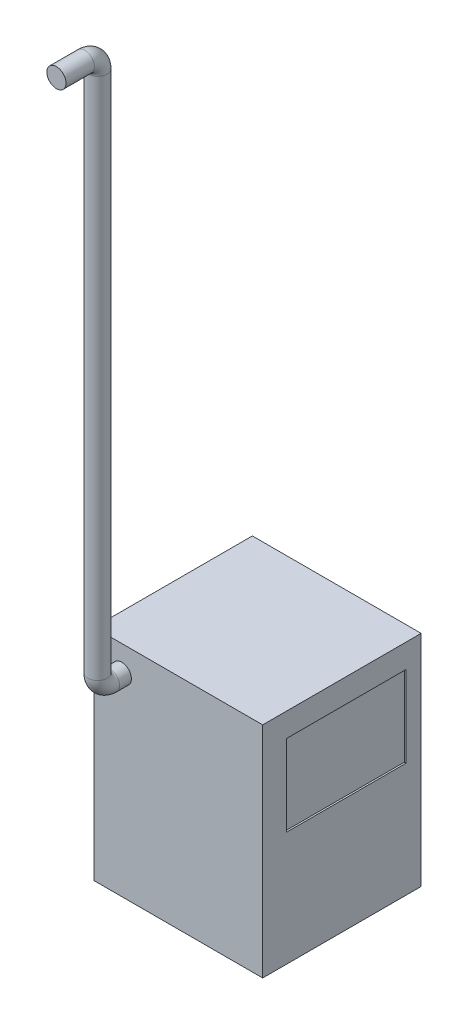
ISO-10303-21;
HEADER;
FILE_DESCRIPTION(('STEP AP214'),'2;1');
FILE_NAME('part.step','',(''),(''),'','','');
FILE_SCHEMA(('AUTOMOTIVE_DESIGN { 1 0 10303 214 1 1 1 1 }'));
ENDSEC;
DATA;
#1=APPLICATION_CONTEXT('core data for automotive mechanical design processes');
#2=APPLICATION_PROTOCOL_DEFINITION('international standard','automotive_design',2000,#1);
#3=PRODUCT_CONTEXT('',#1,'mechanical');
#4=PRODUCT('Part','Part','',(#3));
#5=PRODUCT_RELATED_PRODUCT_CATEGORY('part','',(#4));
#6=PRODUCT_DEFINITION_FORMATION('','',#4);
#7=PRODUCT_DEFINITION_CONTEXT('part definition',#1,'design');
#8=PRODUCT_DEFINITION('design','',#6,#7);
#9=PRODUCT_DEFINITION_SHAPE('','',#8);
#10=(LENGTH_UNIT() NAMED_UNIT(*) SI_UNIT(.MILLI.,.METRE.));
#11=(NAMED_UNIT(*) PLANE_ANGLE_UNIT() SI_UNIT($,.RADIAN.));
#12=(NAMED_UNIT(*) SI_UNIT($,.STERADIAN.) SOLID_ANGLE_UNIT());
#13=UNCERTAINTY_MEASURE_WITH_UNIT(LENGTH_MEASURE(1.E-05),#10,'distance_accuracy_value','');
#14=(GEOMETRIC_REPRESENTATION_CONTEXT(3) GLOBAL_UNCERTAINTY_ASSIGNED_CONTEXT((#13)) GLOBAL_UNIT_ASSIGNED_CONTEXT((#10,
#11,#12)) REPRESENTATION_CONTEXT('',''));
#15=CARTESIAN_POINT('',(0.,0.,0.));
#16=DIRECTION('',(0.,0.,1.));
#17=DIRECTION('',(1.,0.,0.));
#18=AXIS2_PLACEMENT_3D('',#15,#16,#17);
#19=CARTESIAN_POINT('',(200.,129.891252072639,-93.8981552431528));
#20=DIRECTION('',(0.,0.,1.));
#21=DIRECTION('',(1.,0.,0.));
#22=AXIS2_PLACEMENT_3D('',#19,#20,#21);
#23=PLANE('',#22);
#24=DIRECTION('',(0.,1.,0.));
#25=VECTOR('',#24,1.);
#26=CARTESIAN_POINT('',(0.,129.891252072639,-93.8981552431528));
#27=LINE('',#26,#25);
#28=CARTESIAN_POINT('',(0.,-129.891252072639,-93.8981552431528));
#29=VERTEX_POINT('',#28);
#30=CARTESIAN_POINT('',(0.,129.891252072639,-93.8981552431528));
#31=VERTEX_POINT('',#30);
#32=EDGE_CURVE('E143',#29,#31,#27,.T.);
#33=ORIENTED_EDGE('',*,*,#32,.T.);
#34=DIRECTION('',(-1.,0.,0.));
#35=VECTOR('',#34,1.);
#36=CARTESIAN_POINT('',(200.,129.891252072639,-93.8981552431528));
#37=LINE('',#36,#35);
#38=CARTESIAN_POINT('',(200.,129.891252072639,-93.8981552431528));
#39=VERTEX_POINT('',#38);
#40=EDGE_CURVE('E11',#39,#31,#37,.T.);
#41=ORIENTED_EDGE('',*,*,#40,.F.);
#42=DIRECTION('',(0.,1.,0.));
#43=VECTOR('',#42,1.);
#44=CARTESIAN_POINT('',(200.,129.891252072639,-93.8981552431528));
#45=LINE('',#44,#43);
#46=CARTESIAN_POINT('',(200.,-129.891252072639,-93.8981552431528));
#47=VERTEX_POINT('',#46);
#48=EDGE_CURVE('E147',#47,#39,#45,.T.);
#49=ORIENTED_EDGE('',*,*,#48,.F.);
#50=DIRECTION('',(-1.,0.,0.));
#51=VECTOR('',#50,1.);
#52=CARTESIAN_POINT('',(200.,-129.891252072639,-93.8981552431528));
#53=LINE('',#52,#51);
#54=EDGE_CURVE('E153',#47,#29,#53,.T.);
#55=ORIENTED_EDGE('',*,*,#54,.T.);
#56=EDGE_LOOP('',(#33,#41,#49,#55));
#57=FACE_BOUND('',#56,.T.);
#58=ADVANCED_FACE('F32',(#57),#23,.F.);
#59=CARTESIAN_POINT('',(200.,129.891252072639,93.8981552431528));
#60=DIRECTION('',(0.,-1.,0.));
#61=DIRECTION('',(0.,0.,-1.));
#62=AXIS2_PLACEMENT_3D('',#59,#60,#61);
#63=PLANE('',#62);
#64=DIRECTION('',(0.,0.,1.));
#65=VECTOR('',#64,1.);
#66=CARTESIAN_POINT('',(0.,129.891252072639,93.8981552431528));
#67=LINE('',#66,#65);
#68=CARTESIAN_POINT('',(0.,129.891252072639,93.8981552431528));
#69=VERTEX_POINT('',#68);
#70=EDGE_CURVE('E156',#31,#69,#67,.T.);
#71=ORIENTED_EDGE('',*,*,#70,.T.);
#72=DIRECTION('',(-1.,0.,0.));
#73=VECTOR('',#72,1.);
#74=CARTESIAN_POINT('',(200.,129.891252072639,93.8981552431528));
#75=LINE('',#74,#73);
#76=CARTESIAN_POINT('',(200.,129.891252072639,93.8981552431528));
#77=VERTEX_POINT('',#76);
#78=EDGE_CURVE('E39',#77,#69,#75,.T.);
#79=ORIENTED_EDGE('',*,*,#78,.F.);
#80=DIRECTION('',(0.,0.,1.));
#81=VECTOR('',#80,1.);
#82=CARTESIAN_POINT('',(200.,129.891252072639,93.8981552431528));
#83=LINE('',#82,#81);
#84=EDGE_CURVE('E83',#39,#77,#83,.T.);
#85=ORIENTED_EDGE('',*,*,#84,.F.);
#86=ORIENTED_EDGE('',*,*,#40,.T.);
#87=EDGE_LOOP('',(#71,#79,#85,#86));
#88=FACE_BOUND('',#87,.T.);
#89=ADVANCED_FACE('F185',(#88),#63,.F.);
#90=CARTESIAN_POINT('',(200.,129.891252072639,93.8981552431528));
#91=DIRECTION('',(0.,0.,-1.));
#92=DIRECTION('',(-1.,0.,0.));
#93=AXIS2_PLACEMENT_3D('',#90,#91,#92);
#94=PLANE('',#93);
#95=CARTESIAN_POINT('',(33.0406036423483,99.3360660067637,93.8981552431528));
#96=DIRECTION('',(0.,0.,1.));
#97=DIRECTION('',(1.,0.,0.));
#98=AXIS2_PLACEMENT_3D('',#95,#96,#97);
#99=CIRCLE('',#98,11.3678878439545);
#100=CARTESIAN_POINT('',(44.4084914863028,99.3360660067637,93.8981552431528));
#101=VERTEX_POINT('',#100);
#102=EDGE_CURVE('E342',#101,#101,#99,.T.);
#103=ORIENTED_EDGE('',*,*,#102,.F.);
#104=EDGE_LOOP('',(#103));
#105=FACE_BOUND('',#104,.T.);
#106=DIRECTION('',(0.,-1.,0.));
#107=VECTOR('',#106,1.);
#108=CARTESIAN_POINT('',(0.,129.891252072639,93.8981552431528));
#109=LINE('',#108,#107);
#110=CARTESIAN_POINT('',(0.,-129.891252072639,93.8981552431528));
#111=VERTEX_POINT('',#110);
#112=EDGE_CURVE('E158',#69,#111,#109,.T.);
#113=ORIENTED_EDGE('',*,*,#112,.T.);
#114=DIRECTION('',(-1.,0.,0.));
#115=VECTOR('',#114,1.);
#116=CARTESIAN_POINT('',(200.,-129.891252072639,93.8981552431528));
#117=LINE('',#116,#115);
#118=CARTESIAN_POINT('',(200.,-129.891252072639,93.8981552431528));
#119=VERTEX_POINT('',#118);
#120=EDGE_CURVE('E162',#119,#111,#117,.T.);
#121=ORIENTED_EDGE('',*,*,#120,.F.);
#122=DIRECTION('',(0.,-1.,0.));
#123=VECTOR('',#122,1.);
#124=CARTESIAN_POINT('',(200.,129.891252072639,93.8981552431528));
#125=LINE('',#124,#123);
#126=EDGE_CURVE('E150',#77,#119,#125,.T.);
#127=ORIENTED_EDGE('',*,*,#126,.F.);
#128=ORIENTED_EDGE('',*,*,#78,.T.);
#129=EDGE_LOOP('',(#113,#121,#127,#128));
#130=FACE_BOUND('',#129,.T.);
#131=ADVANCED_FACE('F167',(#105,#130),#94,.F.);
#132=CARTESIAN_POINT('',(200.,-129.891252072639,93.8981552431528));
#133=DIRECTION('',(0.,1.,0.));
#134=DIRECTION('',(0.,0.,1.));
#135=AXIS2_PLACEMENT_3D('',#132,#133,#134);
#136=PLANE('',#135);
#137=DIRECTION('',(0.,0.,-1.));
#138=VECTOR('',#137,1.);
#139=CARTESIAN_POINT('',(0.,-129.891252072639,93.8981552431528));
#140=LINE('',#139,#138);
#141=EDGE_CURVE('E76',#111,#29,#140,.T.);
#142=ORIENTED_EDGE('',*,*,#141,.T.);
#143=ORIENTED_EDGE('',*,*,#54,.F.);
#144=DIRECTION('',(0.,0.,-1.));
#145=VECTOR('',#144,1.);
#146=CARTESIAN_POINT('',(200.,-129.891252072639,93.8981552431528));
#147=LINE('',#146,#145);
#148=EDGE_CURVE('E55',#119,#47,#147,.T.);
#149=ORIENTED_EDGE('',*,*,#148,.F.);
#150=ORIENTED_EDGE('',*,*,#120,.T.);
#151=EDGE_LOOP('',(#142,#143,#149,#150));
#152=FACE_BOUND('',#151,.T.);
#153=ADVANCED_FACE('F175',(#152),#136,.F.);
#154=CARTESIAN_POINT('',(200.,0.,0.));
#155=DIRECTION('',(1.,0.,0.));
#156=DIRECTION('',(0.,0.,-1.));
#157=AXIS2_PLACEMENT_3D('',#154,#155,#156);
#158=PLANE('',#157);
#159=DIRECTION('',(0.,-1.,0.));
#160=VECTOR('',#159,1.);
#161=CARTESIAN_POINT('',(200.,101.766622399339,65.5680643552614));
#162=LINE('',#161,#160);
#163=CARTESIAN_POINT('',(200.,101.766622399339,65.5680643552614));
#164=VERTEX_POINT('',#163);
#165=CARTESIAN_POINT('',(200.,5.62292953907217,65.5680643552614));
#166=VERTEX_POINT('',#165);
#167=EDGE_CURVE('E46',#164,#166,#162,.T.);
#168=ORIENTED_EDGE('',*,*,#167,.F.);
#169=DIRECTION('',(0.,0.,1.));
#170=VECTOR('',#169,1.);
#171=CARTESIAN_POINT('',(200.,101.766622399339,65.5680643552614));
#172=LINE('',#171,#170);
#173=CARTESIAN_POINT('',(200.,101.766622399339,-76.1470531604118));
#174=VERTEX_POINT('',#173);
#175=EDGE_CURVE('E125',#174,#164,#172,.T.);
#176=ORIENTED_EDGE('',*,*,#175,.F.);
#177=DIRECTION('',(0.,1.,0.));
#178=VECTOR('',#177,1.);
#179=CARTESIAN_POINT('',(200.,101.766622399339,-76.1470531604118));
#180=LINE('',#179,#178);
#181=CARTESIAN_POINT('',(200.,5.62292953907217,-76.1470531604118));
#182=VERTEX_POINT('',#181);
#183=EDGE_CURVE('E128',#182,#174,#180,.T.);
#184=ORIENTED_EDGE('',*,*,#183,.F.);
#185=DIRECTION('',(0.,0.,-1.));
#186=VECTOR('',#185,1.);
#187=CARTESIAN_POINT('',(200.,5.62292953907217,65.5680643552614));
#188=LINE('',#187,#186);
#189=EDGE_CURVE('E137',#166,#182,#188,.T.);
#190=ORIENTED_EDGE('',*,*,#189,.F.);
#191=EDGE_LOOP('',(#168,#176,#184,#190));
#192=FACE_BOUND('',#191,.T.);
#193=ORIENTED_EDGE('',*,*,#48,.T.);
#194=ORIENTED_EDGE('',*,*,#84,.T.);
#195=ORIENTED_EDGE('',*,*,#126,.T.);
#196=ORIENTED_EDGE('',*,*,#148,.T.);
#197=EDGE_LOOP('',(#193,#194,#195,#196));
#198=FACE_BOUND('',#197,.T.);
#199=ADVANCED_FACE('F177',(#192,#198),#158,.T.);
#200=CARTESIAN_POINT('',(0.,0.,0.));
#201=DIRECTION('',(1.,0.,0.));
#202=DIRECTION('',(0.,0.,-1.));
#203=AXIS2_PLACEMENT_3D('',#200,#201,#202);
#204=PLANE('',#203);
#205=ORIENTED_EDGE('',*,*,#32,.F.);
#206=ORIENTED_EDGE('',*,*,#141,.F.);
#207=ORIENTED_EDGE('',*,*,#112,.F.);
#208=ORIENTED_EDGE('',*,*,#70,.F.);
#209=EDGE_LOOP('',(#205,#206,#207,#208));
#210=FACE_BOUND('',#209,.T.);
#211=ADVANCED_FACE('F171',(#210),#204,.F.);
#212=CARTESIAN_POINT('',(198.,101.766622399339,65.5680643552614));
#213=DIRECTION('',(0.,0.,1.));
#214=DIRECTION('',(1.,0.,0.));
#215=AXIS2_PLACEMENT_3D('',#212,#213,#214);
#216=PLANE('',#215);
#217=ORIENTED_EDGE('',*,*,#167,.T.);
#218=DIRECTION('',(1.,0.,0.));
#219=VECTOR('',#218,1.);
#220=CARTESIAN_POINT('',(198.,5.62292953907217,65.5680643552614));
#221=LINE('',#220,#219);
#222=CARTESIAN_POINT('',(198.,5.62292953907217,65.5680643552614));
#223=VERTEX_POINT('',#222);
#224=EDGE_CURVE('E103',#223,#166,#221,.T.);
#225=ORIENTED_EDGE('',*,*,#224,.F.);
#226=DIRECTION('',(0.,-1.,0.));
#227=VECTOR('',#226,1.);
#228=CARTESIAN_POINT('',(198.,101.766622399339,65.5680643552614));
#229=LINE('',#228,#227);
#230=CARTESIAN_POINT('',(198.,101.766622399339,65.5680643552614));
#231=VERTEX_POINT('',#230);
#232=EDGE_CURVE('E107',#231,#223,#229,.T.);
#233=ORIENTED_EDGE('',*,*,#232,.F.);
#234=DIRECTION('',(1.,0.,0.));
#235=VECTOR('',#234,1.);
#236=CARTESIAN_POINT('',(198.,101.766622399339,65.5680643552614));
#237=LINE('',#236,#235);
#238=EDGE_CURVE('E141',#231,#164,#237,.T.);
#239=ORIENTED_EDGE('',*,*,#238,.T.);
#240=EDGE_LOOP('',(#217,#225,#233,#239));
#241=FACE_BOUND('',#240,.T.);
#242=ADVANCED_FACE('F105',(#241),#216,.F.);
#243=CARTESIAN_POINT('',(198.,101.766622399339,65.5680643552614));
#244=DIRECTION('',(0.,1.,0.));
#245=DIRECTION('',(0.,0.,1.));
#246=AXIS2_PLACEMENT_3D('',#243,#244,#245);
#247=PLANE('',#246);
#248=ORIENTED_EDGE('',*,*,#175,.T.);
#249=ORIENTED_EDGE('',*,*,#238,.F.);
#250=DIRECTION('',(0.,0.,1.));
#251=VECTOR('',#250,1.);
#252=CARTESIAN_POINT('',(198.,101.766622399339,65.5680643552614));
#253=LINE('',#252,#251);
#254=CARTESIAN_POINT('',(198.,101.766622399339,-76.1470531604118));
#255=VERTEX_POINT('',#254);
#256=EDGE_CURVE('E113',#255,#231,#253,.T.);
#257=ORIENTED_EDGE('',*,*,#256,.F.);
#258=DIRECTION('',(1.,0.,0.));
#259=VECTOR('',#258,1.);
#260=CARTESIAN_POINT('',(198.,101.766622399339,-76.1470531604118));
#261=LINE('',#260,#259);
#262=EDGE_CURVE('E144',#255,#174,#261,.T.);
#263=ORIENTED_EDGE('',*,*,#262,.T.);
#264=EDGE_LOOP('',(#248,#249,#257,#263));
#265=FACE_BOUND('',#264,.T.);
#266=ADVANCED_FACE('F277',(#265),#247,.F.);
#267=CARTESIAN_POINT('',(198.,101.766622399339,-76.1470531604118));
#268=DIRECTION('',(0.,0.,-1.));
#269=DIRECTION('',(-1.,0.,0.));
#270=AXIS2_PLACEMENT_3D('',#267,#268,#269);
#271=PLANE('',#270);
#272=ORIENTED_EDGE('',*,*,#183,.T.);
#273=ORIENTED_EDGE('',*,*,#262,.F.);
#274=DIRECTION('',(0.,1.,0.));
#275=VECTOR('',#274,1.);
#276=CARTESIAN_POINT('',(198.,101.766622399339,-76.1470531604118));
#277=LINE('',#276,#275);
#278=CARTESIAN_POINT('',(198.,5.62292953907217,-76.1470531604118));
#279=VERTEX_POINT('',#278);
#280=EDGE_CURVE('E121',#279,#255,#277,.T.);
#281=ORIENTED_EDGE('',*,*,#280,.F.);
#282=DIRECTION('',(1.,0.,0.));
#283=VECTOR('',#282,1.);
#284=CARTESIAN_POINT('',(198.,5.62292953907217,-76.1470531604118));
#285=LINE('',#284,#283);
#286=EDGE_CURVE('E112',#279,#182,#285,.T.);
#287=ORIENTED_EDGE('',*,*,#286,.T.);
#288=EDGE_LOOP('',(#272,#273,#281,#287));
#289=FACE_BOUND('',#288,.T.);
#290=ADVANCED_FACE('F274',(#289),#271,.F.);
#291=CARTESIAN_POINT('',(198.,5.62292953907217,65.5680643552614));
#292=DIRECTION('',(0.,-1.,0.));
#293=DIRECTION('',(0.,0.,-1.));
#294=AXIS2_PLACEMENT_3D('',#291,#292,#293);
#295=PLANE('',#294);
#296=ORIENTED_EDGE('',*,*,#189,.T.);
#297=ORIENTED_EDGE('',*,*,#286,.F.);
#298=DIRECTION('',(0.,0.,-1.));
#299=VECTOR('',#298,1.);
#300=CARTESIAN_POINT('',(198.,5.62292953907217,65.5680643552614));
#301=LINE('',#300,#299);
#302=EDGE_CURVE('E116',#223,#279,#301,.T.);
#303=ORIENTED_EDGE('',*,*,#302,.F.);
#304=ORIENTED_EDGE('',*,*,#224,.T.);
#305=EDGE_LOOP('',(#296,#297,#303,#304));
#306=FACE_BOUND('',#305,.T.);
#307=ADVANCED_FACE('F117',(#306),#295,.F.);
#308=CARTESIAN_POINT('',(198.,0.,0.));
#309=DIRECTION('',(1.,0.,0.));
#310=DIRECTION('',(0.,0.,-1.));
#311=AXIS2_PLACEMENT_3D('',#308,#309,#310);
#312=PLANE('',#311);
#313=ORIENTED_EDGE('',*,*,#232,.T.);
#314=ORIENTED_EDGE('',*,*,#302,.T.);
#315=ORIENTED_EDGE('',*,*,#280,.T.);
#316=ORIENTED_EDGE('',*,*,#256,.T.);
#317=EDGE_LOOP('',(#313,#314,#315,#316));
#318=FACE_BOUND('',#317,.T.);
#319=ADVANCED_FACE('F123',(#318),#312,.T.);
#320=CARTESIAN_POINT('',(33.0406036423483,749.336066006764,171.355386401238));
#321=DIRECTION('',(0.,0.,1.));
#322=DIRECTION('',(1.,0.,0.));
#323=AXIS2_PLACEMENT_3D('',#320,#321,#322);
#324=PLANE('',#323);
#325=CARTESIAN_POINT('',(33.0406036423483,749.336066006764,171.355386401238));
#326=DIRECTION('',(0.,0.,1.));
#327=DIRECTION('',(1.,0.,0.));
#328=AXIS2_PLACEMENT_3D('',#325,#326,#327);
#329=CIRCLE('',#328,11.3678878439545);
#330=CARTESIAN_POINT('',(44.4084914863028,749.336066006764,171.355386401238));
#331=VERTEX_POINT('',#330);
#332=EDGE_CURVE('E131',#331,#331,#329,.T.);
#333=ORIENTED_EDGE('',*,*,#332,.T.);
#334=EDGE_LOOP('',(#333));
#335=FACE_BOUND('',#334,.T.);
#336=ADVANCED_FACE('F210',(#335),#324,.T.);
#337=CARTESIAN_POINT('',(33.0406036423483,99.3360660067637,93.8981552431528));
#338=DIRECTION('',(0.,0.,1.));
#339=DIRECTION('',(1.,0.,0.));
#340=AXIS2_PLACEMENT_3D('',#337,#338,#339);
#341=CYLINDRICAL_SURFACE('',#340,11.3678878439545);
#342=CARTESIAN_POINT('',(33.0406036423483,99.3360660067637,107.772716537554));
#343=DIRECTION('',(0.,0.,1.));
#344=DIRECTION('',(1.,0.,0.));
#345=AXIS2_PLACEMENT_3D('',#342,#343,#344);
#346=CIRCLE('',#345,11.3678878439545);
#347=CARTESIAN_POINT('',(33.0406036423483,87.9681781628092,107.772716537554));
#348=VERTEX_POINT('',#347);
#349=EDGE_CURVE('E339',#348,#348,#346,.T.);
#350=ORIENTED_EDGE('',*,*,#349,.F.);
#351=EDGE_LOOP('',(#350));
#352=FACE_BOUND('',#351,.T.);
#353=ORIENTED_EDGE('',*,*,#102,.T.);
#354=EDGE_LOOP('',(#353));
#355=FACE_BOUND('',#354,.T.);
#356=ADVANCED_FACE('F215',(#352,#355),#341,.T.);
#357=CARTESIAN_POINT('',(33.0406036423483,114.336066006764,107.772716537554));
#358=DIRECTION('',(-1.,0.,0.));
#359=DIRECTION('',(0.,0.,1.));
#360=AXIS2_PLACEMENT_3D('',#357,#358,#359);
#361=TOROIDAL_SURFACE('',#360,15.,11.3678878439545);
#362=CARTESIAN_POINT('',(33.0406036423483,114.336066006764,122.772716537554));
#363=DIRECTION('',(0.,1.,0.));
#364=DIRECTION('',(1.,0.,0.));
#365=AXIS2_PLACEMENT_3D('',#362,#363,#364);
#366=CIRCLE('',#365,11.3678878439545);
#367=CARTESIAN_POINT('',(33.0406036423483,114.336066006764,134.140604381509));
#368=VERTEX_POINT('',#367);
#369=EDGE_CURVE('E334',#368,#368,#366,.T.);
#370=CARTESIAN_POINT('',(33.0406036423483,114.336066006764,107.772716537554));
#371=DIRECTION('',(-1.,0.,0.));
#372=DIRECTION('',(0.,0.,1.));
#373=AXIS2_PLACEMENT_3D('',#370,#371,#372);
#374=CIRCLE('',#373,26.3678878439545);
#375=EDGE_CURVE('',#348,#368,#374,.T.);
#376=ORIENTED_EDGE('',*,*,#349,.T.);
#377=ORIENTED_EDGE('',*,*,#369,.F.);
#378=ORIENTED_EDGE('',*,*,#375,.T.);
#379=ORIENTED_EDGE('',*,*,#375,.F.);
#380=EDGE_LOOP('',(#376,#378,#377,#379));
#381=FACE_BOUND('',#380,.T.);
#382=ADVANCED_FACE('F225',(#381),#361,.T.);
#383=CARTESIAN_POINT('',(33.0406036423483,114.336066006764,122.772716537554));
#384=DIRECTION('',(0.,1.,0.));
#385=DIRECTION('',(0.,0.,1.));
#386=AXIS2_PLACEMENT_3D('',#383,#384,#385);
#387=CYLINDRICAL_SURFACE('',#386,11.3678878439545);
#388=CARTESIAN_POINT('',(33.0406036423483,734.336066006764,122.772716537554));
#389=DIRECTION('',(0.,1.,0.));
#390=DIRECTION('',(1.,0.,0.));
#391=AXIS2_PLACEMENT_3D('',#388,#389,#390);
#392=CIRCLE('',#391,11.3678878439545);
#393=CARTESIAN_POINT('',(33.0406036423483,734.336066006764,111.4048286936));
#394=VERTEX_POINT('',#393);
#395=EDGE_CURVE('E332',#394,#394,#392,.T.);
#396=ORIENTED_EDGE('',*,*,#395,.F.);
#397=EDGE_LOOP('',(#396));
#398=FACE_BOUND('',#397,.T.);
#399=ORIENTED_EDGE('',*,*,#369,.T.);
#400=EDGE_LOOP('',(#399));
#401=FACE_BOUND('',#400,.T.);
#402=ADVANCED_FACE('F235',(#398,#401),#387,.T.);
#403=CARTESIAN_POINT('',(33.0406036423483,734.336066006764,137.772716537554));
#404=DIRECTION('',(1.,0.,0.));
#405=DIRECTION('',(0.,0.,-1.));
#406=AXIS2_PLACEMENT_3D('',#403,#404,#405);
#407=TOROIDAL_SURFACE('',#406,15.,11.3678878439545);
#408=CARTESIAN_POINT('',(33.0406036423483,749.336066006764,137.772716537554));
#409=DIRECTION('',(0.,0.,1.));
#410=DIRECTION('',(1.,0.,0.));
#411=AXIS2_PLACEMENT_3D('',#408,#409,#410);
#412=CIRCLE('',#411,11.3678878439545);
#413=CARTESIAN_POINT('',(33.0406036423483,760.703953850718,137.772716537554));
#414=VERTEX_POINT('',#413);
#415=EDGE_CURVE('E331',#414,#414,#412,.T.);
#416=CARTESIAN_POINT('',(33.0406036423483,734.336066006764,137.772716537554));
#417=DIRECTION('',(1.,0.,0.));
#418=DIRECTION('',(0.,0.,-1.));
#419=AXIS2_PLACEMENT_3D('',#416,#417,#418);
#420=CIRCLE('',#419,26.3678878439546);
#421=EDGE_CURVE('',#394,#414,#420,.T.);
#422=ORIENTED_EDGE('',*,*,#395,.T.);
#423=ORIENTED_EDGE('',*,*,#415,.F.);
#424=ORIENTED_EDGE('',*,*,#421,.T.);
#425=ORIENTED_EDGE('',*,*,#421,.F.);
#426=EDGE_LOOP('',(#422,#424,#423,#425));
#427=FACE_BOUND('',#426,.T.);
#428=ADVANCED_FACE('F245',(#427),#407,.T.);
#429=CARTESIAN_POINT('',(33.0406036423483,749.336066006764,137.772716537554));
#430=DIRECTION('',(0.,0.,1.));
#431=DIRECTION('',(1.,0.,0.));
#432=AXIS2_PLACEMENT_3D('',#429,#430,#431);
#433=CYLINDRICAL_SURFACE('',#432,11.3678878439545);
#434=ORIENTED_EDGE('',*,*,#332,.F.);
#435=EDGE_LOOP('',(#434));
#436=FACE_BOUND('',#435,.T.);
#437=ORIENTED_EDGE('',*,*,#415,.T.);
#438=EDGE_LOOP('',(#437));
#439=FACE_BOUND('',#438,.T.);
#440=ADVANCED_FACE('F255',(#436,#439),#433,.T.);
#441=CLOSED_SHELL('',(#58,#89,#131,#153,#199,#211,#242,#266,#290,#307,#319,#336,#356,#382,#402,
#428,#440));
#442=MANIFOLD_SOLID_BREP('B2',#441);
#443=ADVANCED_BREP_SHAPE_REPRESENTATION('',(#18,#442),#14);
#444=SHAPE_DEFINITION_REPRESENTATION(#9,#443);
ENDSEC;
END-ISO-10303-21;
